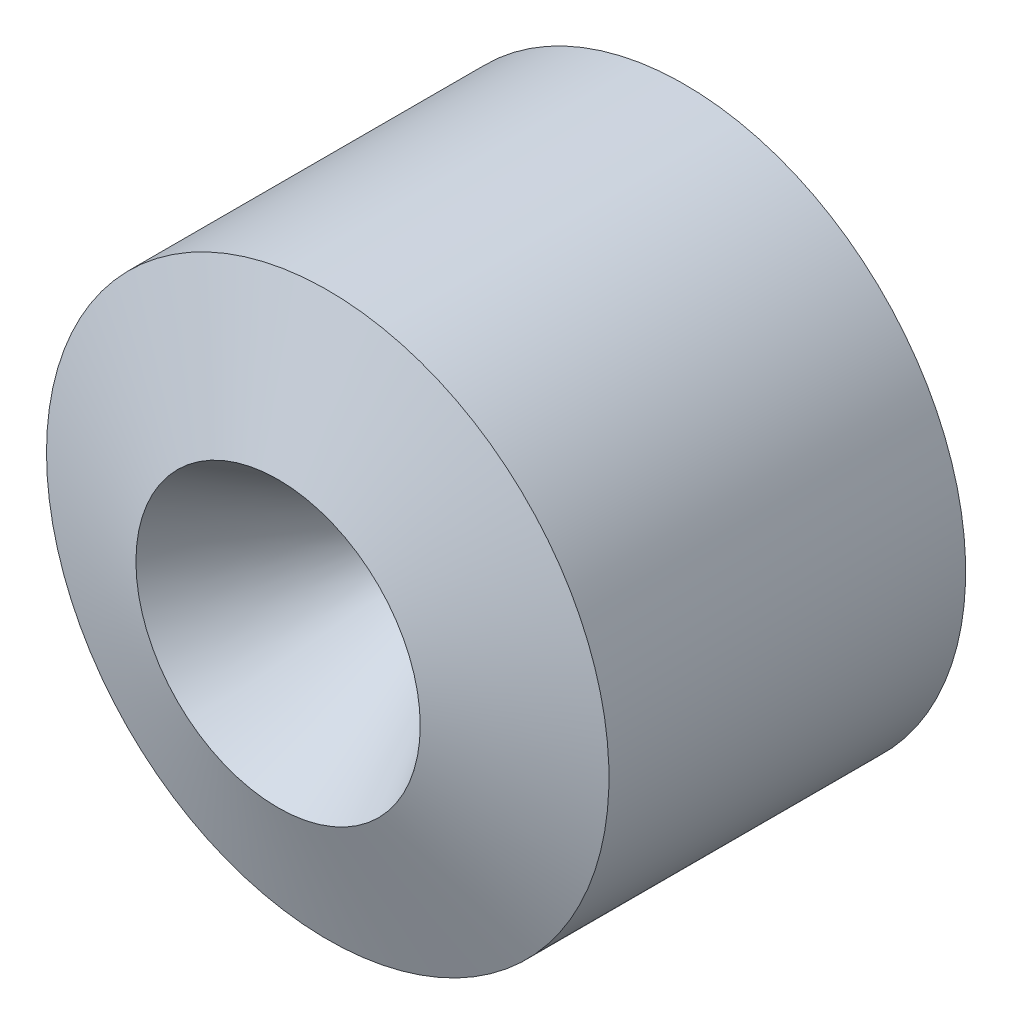
ISO-10303-21;
HEADER;
FILE_DESCRIPTION(('STEP AP214'),'2;1');
FILE_NAME('part.step','',(''),(''),'','','');
FILE_SCHEMA(('AUTOMOTIVE_DESIGN { 1 0 10303 214 1 1 1 1 }'));
ENDSEC;
DATA;
#1=APPLICATION_CONTEXT('core data for automotive mechanical design processes');
#2=APPLICATION_PROTOCOL_DEFINITION('international standard','automotive_design',2000,#1);
#3=PRODUCT_CONTEXT('',#1,'mechanical');
#4=PRODUCT('Part','Part','',(#3));
#5=PRODUCT_RELATED_PRODUCT_CATEGORY('part','',(#4));
#6=PRODUCT_DEFINITION_FORMATION('','',#4);
#7=PRODUCT_DEFINITION_CONTEXT('part definition',#1,'design');
#8=PRODUCT_DEFINITION('design','',#6,#7);
#9=PRODUCT_DEFINITION_SHAPE('','',#8);
#10=(LENGTH_UNIT() NAMED_UNIT(*) SI_UNIT(.MILLI.,.METRE.));
#11=(NAMED_UNIT(*) PLANE_ANGLE_UNIT() SI_UNIT($,.RADIAN.));
#12=(NAMED_UNIT(*) SI_UNIT($,.STERADIAN.) SOLID_ANGLE_UNIT());
#13=UNCERTAINTY_MEASURE_WITH_UNIT(LENGTH_MEASURE(1.E-05),#10,'distance_accuracy_value','');
#14=(GEOMETRIC_REPRESENTATION_CONTEXT(3) GLOBAL_UNCERTAINTY_ASSIGNED_CONTEXT((#13)) GLOBAL_UNIT_ASSIGNED_CONTEXT((#10,
#11,#12)) REPRESENTATION_CONTEXT('',''));
#15=CARTESIAN_POINT('',(0.,0.,0.));
#16=DIRECTION('',(0.,0.,1.));
#17=DIRECTION('',(1.,0.,0.));
#18=AXIS2_PLACEMENT_3D('',#15,#16,#17);
#19=CARTESIAN_POINT('',(0.,16.803624,-10.341356));
#20=DIRECTION('',(0.,0.,-1.));
#21=DIRECTION('',(-1.,0.,0.));
#22=AXIS2_PLACEMENT_3D('',#19,#20,#21);
#23=PLANE('',#22);
#24=CARTESIAN_POINT('',(0.,0.,-10.341356));
#25=DIRECTION('',(0.,0.,-1.));
#26=DIRECTION('',(-1.,0.,0.));
#27=AXIS2_PLACEMENT_3D('',#24,#25,#26);
#28=CIRCLE('',#27,16.803624);
#29=CARTESIAN_POINT('',(-16.803624,0.,-10.341356));
#30=VERTEX_POINT('',#29);
#31=EDGE_CURVE('E11',#30,#30,#28,.T.);
#32=ORIENTED_EDGE('',*,*,#31,.T.);
#33=EDGE_LOOP('',(#32));
#34=FACE_BOUND('',#33,.T.);
#35=ADVANCED_FACE('F33',(#34),#23,.T.);
#36=CARTESIAN_POINT('',(0.,0.,-10.341356));
#37=DIRECTION('',(0.,0.,-1.));
#38=DIRECTION('',(-1.,0.,0.));
#39=AXIS2_PLACEMENT_3D('',#36,#37,#38);
#40=CYLINDRICAL_SURFACE('',#39,16.803624);
#41=CARTESIAN_POINT('',(0.,0.,10.97026));
#42=DIRECTION('',(0.,0.,-1.));
#43=DIRECTION('',(-1.,0.,0.));
#44=AXIS2_PLACEMENT_3D('',#41,#42,#43);
#45=CIRCLE('',#44,16.803624);
#46=CARTESIAN_POINT('',(-16.803624,0.,10.97026));
#47=VERTEX_POINT('',#46);
#48=EDGE_CURVE('E39',#47,#47,#45,.T.);
#49=ORIENTED_EDGE('',*,*,#48,.T.);
#50=EDGE_LOOP('',(#49));
#51=FACE_BOUND('',#50,.T.);
#52=ORIENTED_EDGE('',*,*,#31,.F.);
#53=EDGE_LOOP('',(#52));
#54=FACE_BOUND('',#53,.T.);
#55=ADVANCED_FACE('F55',(#51,#54),#40,.T.);
#56=CARTESIAN_POINT('',(0.,0.,10.97026));
#57=DIRECTION('',(0.,0.,-1.));
#58=DIRECTION('',(-1.,0.,0.));
#59=AXIS2_PLACEMENT_3D('',#56,#57,#58);
#60=CONICAL_SURFACE('',#59,16.803624,1.22784402959856);
#61=CARTESIAN_POINT('',(0.,0.,13.937488));
#62=DIRECTION('',(0.,0.,-1.));
#63=DIRECTION('',(-1.,0.,0.));
#64=AXIS2_PLACEMENT_3D('',#61,#62,#63);
#65=CIRCLE('',#64,8.493506);
#66=CARTESIAN_POINT('',(-8.493506,0.,13.937488));
#67=VERTEX_POINT('',#66);
#68=EDGE_CURVE('E49',#67,#67,#65,.T.);
#69=ORIENTED_EDGE('',*,*,#68,.T.);
#70=EDGE_LOOP('',(#69));
#71=FACE_BOUND('',#70,.T.);
#72=ORIENTED_EDGE('',*,*,#48,.F.);
#73=EDGE_LOOP('',(#72));
#74=FACE_BOUND('',#73,.T.);
#75=ADVANCED_FACE('F45',(#71,#74),#60,.T.);
#76=CARTESIAN_POINT('',(0.,0.,13.937488));
#77=DIRECTION('',(0.,0.,1.));
#78=DIRECTION('',(1.,0.,0.));
#79=AXIS2_PLACEMENT_3D('',#76,#77,#78);
#80=CONICAL_SURFACE('',#79,8.493506,0.54730265368207);
#81=CARTESIAN_POINT('',(0.,0.,0.));
#82=VERTEX_POINT('',#81);
#83=VERTEX_LOOP('',#82);
#84=FACE_BOUND('',#83,.T.);
#85=ORIENTED_EDGE('',*,*,#68,.F.);
#86=EDGE_LOOP('',(#85));
#87=FACE_BOUND('',#86,.T.);
#88=ADVANCED_FACE('F42',(#84,#87),#80,.F.);
#89=CLOSED_SHELL('',(#35,#55,#75,#88));
#90=MANIFOLD_SOLID_BREP('B2',#89);
#91=ADVANCED_BREP_SHAPE_REPRESENTATION('',(#18,#90),#14);
#92=SHAPE_DEFINITION_REPRESENTATION(#9,#91);
ENDSEC;
END-ISO-10303-21;
